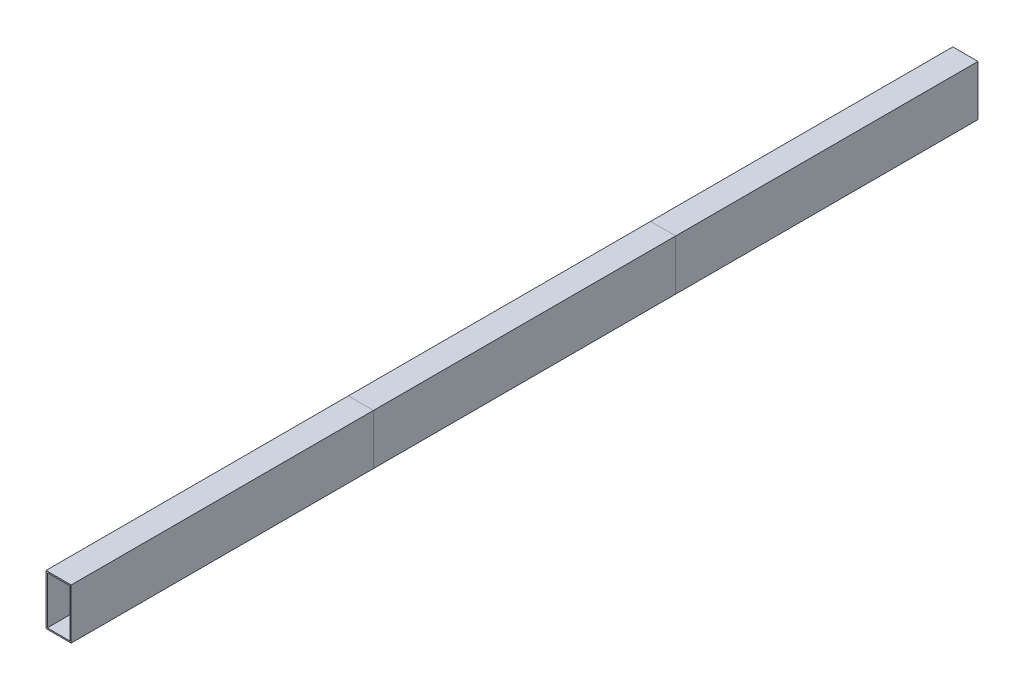
ISO-10303-21;
HEADER;
FILE_DESCRIPTION(('STEP AP214'),'2;1');
FILE_NAME('part.step','',(''),(''),'','','');
FILE_SCHEMA(('AUTOMOTIVE_DESIGN { 1 0 10303 214 1 1 1 1 }'));
ENDSEC;
DATA;
#1=APPLICATION_CONTEXT('core data for automotive mechanical design processes');
#2=APPLICATION_PROTOCOL_DEFINITION('international standard','automotive_design',2000,#1);
#3=PRODUCT_CONTEXT('',#1,'mechanical');
#4=PRODUCT('Part','Part','',(#3));
#5=PRODUCT_RELATED_PRODUCT_CATEGORY('part','',(#4));
#6=PRODUCT_DEFINITION_FORMATION('','',#4);
#7=PRODUCT_DEFINITION_CONTEXT('part definition',#1,'design');
#8=PRODUCT_DEFINITION('design','',#6,#7);
#9=PRODUCT_DEFINITION_SHAPE('','',#8);
#10=(LENGTH_UNIT() NAMED_UNIT(*) SI_UNIT(.MILLI.,.METRE.));
#11=(NAMED_UNIT(*) PLANE_ANGLE_UNIT() SI_UNIT($,.RADIAN.));
#12=(NAMED_UNIT(*) SI_UNIT($,.STERADIAN.) SOLID_ANGLE_UNIT());
#13=UNCERTAINTY_MEASURE_WITH_UNIT(LENGTH_MEASURE(1.E-05),#10,'distance_accuracy_value','');
#14=(GEOMETRIC_REPRESENTATION_CONTEXT(3) GLOBAL_UNCERTAINTY_ASSIGNED_CONTEXT((#13)) GLOBAL_UNIT_ASSIGNED_CONTEXT((#10,
#11,#12)) REPRESENTATION_CONTEXT('',''));
#15=CARTESIAN_POINT('',(0.,0.,0.));
#16=DIRECTION('',(0.,0.,1.));
#17=DIRECTION('',(1.,0.,0.));
#18=AXIS2_PLACEMENT_3D('',#15,#16,#17);
#19=CARTESIAN_POINT('',(-50.,0.,3600.));
#20=DIRECTION('',(-1.,0.,0.));
#21=DIRECTION('',(0.,0.,1.));
#22=AXIS2_PLACEMENT_3D('',#19,#20,#21);
#23=PLANE('',#22);
#24=DIRECTION('',(0.,1.,0.));
#25=VECTOR('',#24,1.);
#26=CARTESIAN_POINT('',(-50.,0.,2400.));
#27=LINE('',#26,#25);
#28=CARTESIAN_POINT('',(-50.,-100.,2400.));
#29=VERTEX_POINT('',#28);
#30=CARTESIAN_POINT('',(-50.,100.,2400.));
#31=VERTEX_POINT('',#30);
#32=EDGE_CURVE('E150',#29,#31,#27,.T.);
#33=ORIENTED_EDGE('',*,*,#32,.F.);
#34=DIRECTION('',(0.,0.,-1.));
#35=VECTOR('',#34,1.);
#36=CARTESIAN_POINT('',(-50.,-100.,3600.));
#37=LINE('',#36,#35);
#38=CARTESIAN_POINT('',(-50.,-100.,3600.));
#39=VERTEX_POINT('',#38);
#40=EDGE_CURVE('E12',#39,#29,#37,.T.);
#41=ORIENTED_EDGE('',*,*,#40,.F.);
#42=DIRECTION('',(0.,1.,0.));
#43=VECTOR('',#42,1.);
#44=CARTESIAN_POINT('',(-50.,0.,3600.));
#45=LINE('',#44,#43);
#46=CARTESIAN_POINT('',(-50.,100.,3600.));
#47=VERTEX_POINT('',#46);
#48=EDGE_CURVE('E154',#39,#47,#45,.T.);
#49=ORIENTED_EDGE('',*,*,#48,.T.);
#50=DIRECTION('',(0.,0.,-1.));
#51=VECTOR('',#50,1.);
#52=CARTESIAN_POINT('',(-50.,100.,3600.));
#53=LINE('',#52,#51);
#54=EDGE_CURVE('E55',#47,#31,#53,.T.);
#55=ORIENTED_EDGE('',*,*,#54,.T.);
#56=EDGE_LOOP('',(#33,#41,#49,#55));
#57=FACE_BOUND('',#56,.T.);
#58=ADVANCED_FACE('F52',(#57),#23,.T.);
#59=CARTESIAN_POINT('',(0.,-100.,3600.));
#60=DIRECTION('',(0.,-1.,0.));
#61=DIRECTION('',(0.,0.,-1.));
#62=AXIS2_PLACEMENT_3D('',#59,#60,#61);
#63=PLANE('',#62);
#64=DIRECTION('',(-1.,0.,0.));
#65=VECTOR('',#64,1.);
#66=CARTESIAN_POINT('',(0.,-100.,2400.));
#67=LINE('',#66,#65);
#68=CARTESIAN_POINT('',(50.,-100.,2400.));
#69=VERTEX_POINT('',#68);
#70=EDGE_CURVE('E158',#69,#29,#67,.T.);
#71=ORIENTED_EDGE('',*,*,#70,.F.);
#72=DIRECTION('',(0.,0.,-1.));
#73=VECTOR('',#72,1.);
#74=CARTESIAN_POINT('',(50.,-100.,3600.));
#75=LINE('',#74,#73);
#76=CARTESIAN_POINT('',(50.,-100.,3600.));
#77=VERTEX_POINT('',#76);
#78=EDGE_CURVE('E60',#77,#69,#75,.T.);
#79=ORIENTED_EDGE('',*,*,#78,.F.);
#80=DIRECTION('',(-1.,0.,0.));
#81=VECTOR('',#80,1.);
#82=CARTESIAN_POINT('',(0.,-100.,3600.));
#83=LINE('',#82,#81);
#84=EDGE_CURVE('E164',#77,#39,#83,.T.);
#85=ORIENTED_EDGE('',*,*,#84,.T.);
#86=ORIENTED_EDGE('',*,*,#40,.T.);
#87=EDGE_LOOP('',(#71,#79,#85,#86));
#88=FACE_BOUND('',#87,.T.);
#89=ADVANCED_FACE('F190',(#88),#63,.T.);
#90=CARTESIAN_POINT('',(50.,0.,3600.));
#91=DIRECTION('',(1.,0.,0.));
#92=DIRECTION('',(0.,0.,-1.));
#93=AXIS2_PLACEMENT_3D('',#90,#91,#92);
#94=PLANE('',#93);
#95=DIRECTION('',(0.,-1.,0.));
#96=VECTOR('',#95,1.);
#97=CARTESIAN_POINT('',(50.,0.,2400.));
#98=LINE('',#97,#96);
#99=CARTESIAN_POINT('',(50.,100.,2400.));
#100=VERTEX_POINT('',#99);
#101=EDGE_CURVE('E172',#100,#69,#98,.T.);
#102=ORIENTED_EDGE('',*,*,#101,.F.);
#103=DIRECTION('',(0.,0.,-1.));
#104=VECTOR('',#103,1.);
#105=CARTESIAN_POINT('',(50.,100.,3600.));
#106=LINE('',#105,#104);
#107=CARTESIAN_POINT('',(50.,100.,3600.));
#108=VERTEX_POINT('',#107);
#109=EDGE_CURVE('E177',#108,#100,#106,.T.);
#110=ORIENTED_EDGE('',*,*,#109,.F.);
#111=DIRECTION('',(0.,-1.,0.));
#112=VECTOR('',#111,1.);
#113=CARTESIAN_POINT('',(50.,0.,3600.));
#114=LINE('',#113,#112);
#115=EDGE_CURVE('E161',#108,#77,#114,.T.);
#116=ORIENTED_EDGE('',*,*,#115,.T.);
#117=ORIENTED_EDGE('',*,*,#78,.T.);
#118=EDGE_LOOP('',(#102,#110,#116,#117));
#119=FACE_BOUND('',#118,.T.);
#120=ADVANCED_FACE('F194',(#119),#94,.T.);
#121=CARTESIAN_POINT('',(0.,100.,3600.));
#122=DIRECTION('',(0.,1.,0.));
#123=DIRECTION('',(0.,0.,1.));
#124=AXIS2_PLACEMENT_3D('',#121,#122,#123);
#125=PLANE('',#124);
#126=DIRECTION('',(1.,0.,0.));
#127=VECTOR('',#126,1.);
#128=CARTESIAN_POINT('',(0.,100.,2400.));
#129=LINE('',#128,#127);
#130=EDGE_CURVE('E169',#31,#100,#129,.T.);
#131=ORIENTED_EDGE('',*,*,#130,.F.);
#132=ORIENTED_EDGE('',*,*,#54,.F.);
#133=DIRECTION('',(1.,0.,0.));
#134=VECTOR('',#133,1.);
#135=CARTESIAN_POINT('',(0.,100.,3600.));
#136=LINE('',#135,#134);
#137=EDGE_CURVE('E157',#47,#108,#136,.T.);
#138=ORIENTED_EDGE('',*,*,#137,.T.);
#139=ORIENTED_EDGE('',*,*,#109,.T.);
#140=EDGE_LOOP('',(#131,#132,#138,#139));
#141=FACE_BOUND('',#140,.T.);
#142=ADVANCED_FACE('F185',(#141),#125,.T.);
#143=CARTESIAN_POINT('',(0.,0.,3600.));
#144=DIRECTION('',(0.,0.,-1.));
#145=DIRECTION('',(-1.,0.,0.));
#146=AXIS2_PLACEMENT_3D('',#143,#144,#145);
#147=PLANE('',#146);
#148=DIRECTION('',(-1.,0.,0.));
#149=VECTOR('',#148,1.);
#150=CARTESIAN_POINT('',(0.,-95.,3600.));
#151=LINE('',#150,#149);
#152=CARTESIAN_POINT('',(45.,-95.,3600.));
#153=VERTEX_POINT('',#152);
#154=CARTESIAN_POINT('',(-45.,-95.,3600.));
#155=VERTEX_POINT('',#154);
#156=EDGE_CURVE('E125',#153,#155,#151,.T.);
#157=ORIENTED_EDGE('',*,*,#156,.T.);
#158=DIRECTION('',(0.,1.,0.));
#159=VECTOR('',#158,1.);
#160=CARTESIAN_POINT('',(-45.,0.,3600.));
#161=LINE('',#160,#159);
#162=CARTESIAN_POINT('',(-45.,95.,3600.));
#163=VERTEX_POINT('',#162);
#164=EDGE_CURVE('E119',#155,#163,#161,.T.);
#165=ORIENTED_EDGE('',*,*,#164,.T.);
#166=DIRECTION('',(1.,0.,0.));
#167=VECTOR('',#166,1.);
#168=CARTESIAN_POINT('',(0.,95.,3600.));
#169=LINE('',#168,#167);
#170=CARTESIAN_POINT('',(45.,95.,3600.));
#171=VERTEX_POINT('',#170);
#172=EDGE_CURVE('E128',#163,#171,#169,.T.);
#173=ORIENTED_EDGE('',*,*,#172,.T.);
#174=DIRECTION('',(0.,-1.,0.));
#175=VECTOR('',#174,1.);
#176=CARTESIAN_POINT('',(45.,0.,3600.));
#177=LINE('',#176,#175);
#178=EDGE_CURVE('E68',#171,#153,#177,.T.);
#179=ORIENTED_EDGE('',*,*,#178,.T.);
#180=EDGE_LOOP('',(#157,#165,#173,#179));
#181=FACE_BOUND('',#180,.T.);
#182=ORIENTED_EDGE('',*,*,#48,.F.);
#183=ORIENTED_EDGE('',*,*,#84,.F.);
#184=ORIENTED_EDGE('',*,*,#115,.F.);
#185=ORIENTED_EDGE('',*,*,#137,.F.);
#186=EDGE_LOOP('',(#182,#183,#184,#185));
#187=FACE_BOUND('',#186,.T.);
#188=ADVANCED_FACE('F132',(#181,#187),#147,.F.);
#189=CARTESIAN_POINT('',(0.,0.,2400.));
#190=DIRECTION('',(0.,0.,-1.));
#191=DIRECTION('',(-1.,0.,0.));
#192=AXIS2_PLACEMENT_3D('',#189,#190,#191);
#193=PLANE('',#192);
#194=DIRECTION('',(0.,1.,0.));
#195=VECTOR('',#194,1.);
#196=CARTESIAN_POINT('',(-45.,0.,2400.));
#197=LINE('',#196,#195);
#198=CARTESIAN_POINT('',(-45.,-95.,2400.));
#199=VERTEX_POINT('',#198);
#200=CARTESIAN_POINT('',(-45.,95.,2400.));
#201=VERTEX_POINT('',#200);
#202=EDGE_CURVE('E76',#199,#201,#197,.T.);
#203=ORIENTED_EDGE('',*,*,#202,.F.);
#204=DIRECTION('',(-1.,0.,0.));
#205=VECTOR('',#204,1.);
#206=CARTESIAN_POINT('',(0.,-95.,2400.));
#207=LINE('',#206,#205);
#208=CARTESIAN_POINT('',(45.,-95.,2400.));
#209=VERTEX_POINT('',#208);
#210=EDGE_CURVE('E135',#209,#199,#207,.T.);
#211=ORIENTED_EDGE('',*,*,#210,.F.);
#212=DIRECTION('',(0.,-1.,0.));
#213=VECTOR('',#212,1.);
#214=CARTESIAN_POINT('',(45.,0.,2400.));
#215=LINE('',#214,#213);
#216=CARTESIAN_POINT('',(45.,95.,2400.));
#217=VERTEX_POINT('',#216);
#218=EDGE_CURVE('E138',#217,#209,#215,.T.);
#219=ORIENTED_EDGE('',*,*,#218,.F.);
#220=DIRECTION('',(1.,0.,0.));
#221=VECTOR('',#220,1.);
#222=CARTESIAN_POINT('',(0.,95.,2400.));
#223=LINE('',#222,#221);
#224=EDGE_CURVE('E144',#201,#217,#223,.T.);
#225=ORIENTED_EDGE('',*,*,#224,.F.);
#226=EDGE_LOOP('',(#203,#211,#219,#225));
#227=FACE_BOUND('',#226,.T.);
#228=ORIENTED_EDGE('',*,*,#32,.T.);
#229=ORIENTED_EDGE('',*,*,#130,.T.);
#230=ORIENTED_EDGE('',*,*,#101,.T.);
#231=ORIENTED_EDGE('',*,*,#70,.T.);
#232=EDGE_LOOP('',(#228,#229,#230,#231));
#233=FACE_BOUND('',#232,.T.);
#234=ADVANCED_FACE('F187',(#227,#233),#193,.T.);
#235=CARTESIAN_POINT('',(-45.,0.,3600.));
#236=DIRECTION('',(-1.,0.,0.));
#237=DIRECTION('',(0.,0.,1.));
#238=AXIS2_PLACEMENT_3D('',#235,#236,#237);
#239=PLANE('',#238);
#240=ORIENTED_EDGE('',*,*,#202,.T.);
#241=DIRECTION('',(0.,0.,-1.));
#242=VECTOR('',#241,1.);
#243=CARTESIAN_POINT('',(-45.,95.,3600.));
#244=LINE('',#243,#242);
#245=EDGE_CURVE('E115',#163,#201,#244,.T.);
#246=ORIENTED_EDGE('',*,*,#245,.F.);
#247=ORIENTED_EDGE('',*,*,#164,.F.);
#248=DIRECTION('',(0.,0.,-1.));
#249=VECTOR('',#248,1.);
#250=CARTESIAN_POINT('',(-45.,-95.,3600.));
#251=LINE('',#250,#249);
#252=EDGE_CURVE('E148',#155,#199,#251,.T.);
#253=ORIENTED_EDGE('',*,*,#252,.T.);
#254=EDGE_LOOP('',(#240,#246,#247,#253));
#255=FACE_BOUND('',#254,.T.);
#256=ADVANCED_FACE('F117',(#255),#239,.F.);
#257=CARTESIAN_POINT('',(0.,-95.,3600.));
#258=DIRECTION('',(0.,-1.,0.));
#259=DIRECTION('',(0.,0.,-1.));
#260=AXIS2_PLACEMENT_3D('',#257,#258,#259);
#261=PLANE('',#260);
#262=ORIENTED_EDGE('',*,*,#210,.T.);
#263=ORIENTED_EDGE('',*,*,#252,.F.);
#264=ORIENTED_EDGE('',*,*,#156,.F.);
#265=DIRECTION('',(0.,0.,-1.));
#266=VECTOR('',#265,1.);
#267=CARTESIAN_POINT('',(45.,-95.,3600.));
#268=LINE('',#267,#266);
#269=EDGE_CURVE('E151',#153,#209,#268,.T.);
#270=ORIENTED_EDGE('',*,*,#269,.T.);
#271=EDGE_LOOP('',(#262,#263,#264,#270));
#272=FACE_BOUND('',#271,.T.);
#273=ADVANCED_FACE('F245',(#272),#261,.F.);
#274=CARTESIAN_POINT('',(45.,0.,3600.));
#275=DIRECTION('',(1.,0.,0.));
#276=DIRECTION('',(0.,0.,-1.));
#277=AXIS2_PLACEMENT_3D('',#274,#275,#276);
#278=PLANE('',#277);
#279=ORIENTED_EDGE('',*,*,#218,.T.);
#280=ORIENTED_EDGE('',*,*,#269,.F.);
#281=ORIENTED_EDGE('',*,*,#178,.F.);
#282=DIRECTION('',(0.,0.,-1.));
#283=VECTOR('',#282,1.);
#284=CARTESIAN_POINT('',(45.,95.,3600.));
#285=LINE('',#284,#283);
#286=EDGE_CURVE('E124',#171,#217,#285,.T.);
#287=ORIENTED_EDGE('',*,*,#286,.T.);
#288=EDGE_LOOP('',(#279,#280,#281,#287));
#289=FACE_BOUND('',#288,.T.);
#290=ADVANCED_FACE('F254',(#289),#278,.F.);
#291=CARTESIAN_POINT('',(0.,95.,3600.));
#292=DIRECTION('',(0.,1.,0.));
#293=DIRECTION('',(0.,0.,1.));
#294=AXIS2_PLACEMENT_3D('',#291,#292,#293);
#295=PLANE('',#294);
#296=ORIENTED_EDGE('',*,*,#224,.T.);
#297=ORIENTED_EDGE('',*,*,#286,.F.);
#298=ORIENTED_EDGE('',*,*,#172,.F.);
#299=ORIENTED_EDGE('',*,*,#245,.T.);
#300=EDGE_LOOP('',(#296,#297,#298,#299));
#301=FACE_BOUND('',#300,.T.);
#302=ADVANCED_FACE('F129',(#301),#295,.F.);
#303=CLOSED_SHELL('',(#58,#89,#120,#142,#188,#234,#256,#273,#290,#302));
#304=MANIFOLD_SOLID_BREP('B2',#303);
#305=CARTESIAN_POINT('',(0.,0.,2400.));
#306=DIRECTION('',(0.,0.,1.));
#307=DIRECTION('',(1.,0.,0.));
#308=AXIS2_PLACEMENT_3D('',#305,#306,#307);
#309=PLANE('',#308);
#310=DIRECTION('',(0.,1.,0.));
#311=VECTOR('',#310,1.);
#312=CARTESIAN_POINT('',(50.,0.,2400.));
#313=LINE('',#312,#311);
#314=CARTESIAN_POINT('',(50.,-100.,2400.));
#315=VERTEX_POINT('',#314);
#316=CARTESIAN_POINT('',(50.,100.,2400.));
#317=VERTEX_POINT('',#316);
#318=EDGE_CURVE('E392',#315,#317,#313,.T.);
#319=ORIENTED_EDGE('',*,*,#318,.T.);
#320=DIRECTION('',(-1.,0.,0.));
#321=VECTOR('',#320,1.);
#322=CARTESIAN_POINT('',(0.,100.,2400.));
#323=LINE('',#322,#321);
#324=CARTESIAN_POINT('',(-50.,100.,2400.));
#325=VERTEX_POINT('',#324);
#326=EDGE_CURVE('E395',#317,#325,#323,.T.);
#327=ORIENTED_EDGE('',*,*,#326,.T.);
#328=DIRECTION('',(0.,-1.,0.));
#329=VECTOR('',#328,1.);
#330=CARTESIAN_POINT('',(-50.,0.,2400.));
#331=LINE('',#330,#329);
#332=CARTESIAN_POINT('',(-50.,-100.,2400.));
#333=VERTEX_POINT('',#332);
#334=EDGE_CURVE('E398',#325,#333,#331,.T.);
#335=ORIENTED_EDGE('',*,*,#334,.T.);
#336=DIRECTION('',(1.,0.,0.));
#337=VECTOR('',#336,1.);
#338=CARTESIAN_POINT('',(0.,-100.,2400.));
#339=LINE('',#338,#337);
#340=EDGE_CURVE('E400',#333,#315,#339,.T.);
#341=ORIENTED_EDGE('',*,*,#340,.T.);
#342=EDGE_LOOP('',(#319,#327,#335,#341));
#343=FACE_BOUND('',#342,.T.);
#344=DIRECTION('',(-1.,0.,0.));
#345=VECTOR('',#344,1.);
#346=CARTESIAN_POINT('',(0.,95.,2400.));
#347=LINE('',#346,#345);
#348=CARTESIAN_POINT('',(45.,95.,2400.));
#349=VERTEX_POINT('',#348);
#350=CARTESIAN_POINT('',(-45.,95.,2400.));
#351=VERTEX_POINT('',#350);
#352=EDGE_CURVE('E364',#349,#351,#347,.T.);
#353=ORIENTED_EDGE('',*,*,#352,.F.);
#354=DIRECTION('',(0.,1.,0.));
#355=VECTOR('',#354,1.);
#356=CARTESIAN_POINT('',(45.,0.,2400.));
#357=LINE('',#356,#355);
#358=CARTESIAN_POINT('',(45.,-95.,2400.));
#359=VERTEX_POINT('',#358);
#360=EDGE_CURVE('E356',#359,#349,#357,.T.);
#361=ORIENTED_EDGE('',*,*,#360,.F.);
#362=DIRECTION('',(1.,0.,0.));
#363=VECTOR('',#362,1.);
#364=CARTESIAN_POINT('',(0.,-95.,2400.));
#365=LINE('',#364,#363);
#366=CARTESIAN_POINT('',(-45.,-95.,2400.));
#367=VERTEX_POINT('',#366);
#368=EDGE_CURVE('E378',#367,#359,#365,.T.);
#369=ORIENTED_EDGE('',*,*,#368,.F.);
#370=DIRECTION('',(0.,-1.,0.));
#371=VECTOR('',#370,1.);
#372=CARTESIAN_POINT('',(-45.,0.,2400.));
#373=LINE('',#372,#371);
#374=EDGE_CURVE('E376',#351,#367,#373,.T.);
#375=ORIENTED_EDGE('',*,*,#374,.F.);
#376=EDGE_LOOP('',(#353,#361,#369,#375));
#377=FACE_BOUND('',#376,.T.);
#378=ADVANCED_FACE('F291',(#343,#377),#309,.T.);
#379=CARTESIAN_POINT('',(0.,0.,1200.));
#380=DIRECTION('',(0.,0.,1.));
#381=DIRECTION('',(1.,0.,0.));
#382=AXIS2_PLACEMENT_3D('',#379,#380,#381);
#383=PLANE('',#382);
#384=DIRECTION('',(0.,1.,0.));
#385=VECTOR('',#384,1.);
#386=CARTESIAN_POINT('',(50.,0.,1200.));
#387=LINE('',#386,#385);
#388=CARTESIAN_POINT('',(50.,-100.,1200.));
#389=VERTEX_POINT('',#388);
#390=CARTESIAN_POINT('',(50.,100.,1200.));
#391=VERTEX_POINT('',#390);
#392=EDGE_CURVE('E372',#389,#391,#387,.T.);
#393=ORIENTED_EDGE('',*,*,#392,.F.);
#394=DIRECTION('',(1.,0.,0.));
#395=VECTOR('',#394,1.);
#396=CARTESIAN_POINT('',(0.,-100.,1200.));
#397=LINE('',#396,#395);
#398=CARTESIAN_POINT('',(-50.,-100.,1200.));
#399=VERTEX_POINT('',#398);
#400=EDGE_CURVE('E396',#399,#389,#397,.T.);
#401=ORIENTED_EDGE('',*,*,#400,.F.);
#402=DIRECTION('',(0.,-1.,0.));
#403=VECTOR('',#402,1.);
#404=CARTESIAN_POINT('',(-50.,0.,1200.));
#405=LINE('',#404,#403);
#406=CARTESIAN_POINT('',(-50.,100.,1200.));
#407=VERTEX_POINT('',#406);
#408=EDGE_CURVE('E407',#407,#399,#405,.T.);
#409=ORIENTED_EDGE('',*,*,#408,.F.);
#410=DIRECTION('',(-1.,0.,0.));
#411=VECTOR('',#410,1.);
#412=CARTESIAN_POINT('',(0.,100.,1200.));
#413=LINE('',#412,#411);
#414=EDGE_CURVE('E405',#391,#407,#413,.T.);
#415=ORIENTED_EDGE('',*,*,#414,.F.);
#416=EDGE_LOOP('',(#393,#401,#409,#415));
#417=FACE_BOUND('',#416,.T.);
#418=DIRECTION('',(0.,1.,0.));
#419=VECTOR('',#418,1.);
#420=CARTESIAN_POINT('',(45.,0.,1200.));
#421=LINE('',#420,#419);
#422=CARTESIAN_POINT('',(45.,-95.,1200.));
#423=VERTEX_POINT('',#422);
#424=CARTESIAN_POINT('',(45.,95.,1200.));
#425=VERTEX_POINT('',#424);
#426=EDGE_CURVE('E314',#423,#425,#421,.T.);
#427=ORIENTED_EDGE('',*,*,#426,.T.);
#428=DIRECTION('',(-1.,0.,0.));
#429=VECTOR('',#428,1.);
#430=CARTESIAN_POINT('',(0.,95.,1200.));
#431=LINE('',#430,#429);
#432=CARTESIAN_POINT('',(-45.,95.,1200.));
#433=VERTEX_POINT('',#432);
#434=EDGE_CURVE('E371',#425,#433,#431,.T.);
#435=ORIENTED_EDGE('',*,*,#434,.T.);
#436=DIRECTION('',(0.,-1.,0.));
#437=VECTOR('',#436,1.);
#438=CARTESIAN_POINT('',(-45.,0.,1200.));
#439=LINE('',#438,#437);
#440=CARTESIAN_POINT('',(-45.,-95.,1200.));
#441=VERTEX_POINT('',#440);
#442=EDGE_CURVE('E384',#433,#441,#439,.T.);
#443=ORIENTED_EDGE('',*,*,#442,.T.);
#444=DIRECTION('',(1.,0.,0.));
#445=VECTOR('',#444,1.);
#446=CARTESIAN_POINT('',(0.,-95.,1200.));
#447=LINE('',#446,#445);
#448=EDGE_CURVE('E365',#441,#423,#447,.T.);
#449=ORIENTED_EDGE('',*,*,#448,.T.);
#450=EDGE_LOOP('',(#427,#435,#443,#449));
#451=FACE_BOUND('',#450,.T.);
#452=ADVANCED_FACE('F425',(#417,#451),#383,.F.);
#453=CARTESIAN_POINT('',(50.,0.,2400.));
#454=DIRECTION('',(-1.,0.,0.));
#455=DIRECTION('',(0.,0.,1.));
#456=AXIS2_PLACEMENT_3D('',#453,#454,#455);
#457=PLANE('',#456);
#458=ORIENTED_EDGE('',*,*,#392,.T.);
#459=DIRECTION('',(0.,0.,-1.));
#460=VECTOR('',#459,1.);
#461=CARTESIAN_POINT('',(50.,100.,2400.));
#462=LINE('',#461,#460);
#463=EDGE_CURVE('E50',#317,#391,#462,.T.);
#464=ORIENTED_EDGE('',*,*,#463,.F.);
#465=ORIENTED_EDGE('',*,*,#318,.F.);
#466=DIRECTION('',(0.,0.,-1.));
#467=VECTOR('',#466,1.);
#468=CARTESIAN_POINT('',(50.,-100.,2400.));
#469=LINE('',#468,#467);
#470=EDGE_CURVE('E402',#315,#389,#469,.T.);
#471=ORIENTED_EDGE('',*,*,#470,.T.);
#472=EDGE_LOOP('',(#458,#464,#465,#471));
#473=FACE_BOUND('',#472,.T.);
#474=ADVANCED_FACE('F293',(#473),#457,.F.);
#475=CARTESIAN_POINT('',(0.,100.,2400.));
#476=DIRECTION('',(0.,-1.,0.));
#477=DIRECTION('',(0.,0.,-1.));
#478=AXIS2_PLACEMENT_3D('',#475,#476,#477);
#479=PLANE('',#478);
#480=ORIENTED_EDGE('',*,*,#414,.T.);
#481=DIRECTION('',(0.,0.,-1.));
#482=VECTOR('',#481,1.);
#483=CARTESIAN_POINT('',(-50.,100.,2400.));
#484=LINE('',#483,#482);
#485=EDGE_CURVE('E299',#325,#407,#484,.T.);
#486=ORIENTED_EDGE('',*,*,#485,.F.);
#487=ORIENTED_EDGE('',*,*,#326,.F.);
#488=ORIENTED_EDGE('',*,*,#463,.T.);
#489=EDGE_LOOP('',(#480,#486,#487,#488));
#490=FACE_BOUND('',#489,.T.);
#491=ADVANCED_FACE('F435',(#490),#479,.F.);
#492=CARTESIAN_POINT('',(-50.,0.,2400.));
#493=DIRECTION('',(1.,0.,0.));
#494=DIRECTION('',(0.,0.,-1.));
#495=AXIS2_PLACEMENT_3D('',#492,#493,#494);
#496=PLANE('',#495);
#497=ORIENTED_EDGE('',*,*,#408,.T.);
#498=DIRECTION('',(0.,0.,-1.));
#499=VECTOR('',#498,1.);
#500=CARTESIAN_POINT('',(-50.,-100.,2400.));
#501=LINE('',#500,#499);
#502=EDGE_CURVE('E412',#333,#399,#501,.T.);
#503=ORIENTED_EDGE('',*,*,#502,.F.);
#504=ORIENTED_EDGE('',*,*,#334,.F.);
#505=ORIENTED_EDGE('',*,*,#485,.T.);
#506=EDGE_LOOP('',(#497,#503,#504,#505));
#507=FACE_BOUND('',#506,.T.);
#508=ADVANCED_FACE('F419',(#507),#496,.F.);
#509=CARTESIAN_POINT('',(0.,-100.,2400.));
#510=DIRECTION('',(0.,1.,0.));
#511=DIRECTION('',(0.,0.,1.));
#512=AXIS2_PLACEMENT_3D('',#509,#510,#511);
#513=PLANE('',#512);
#514=ORIENTED_EDGE('',*,*,#400,.T.);
#515=ORIENTED_EDGE('',*,*,#470,.F.);
#516=ORIENTED_EDGE('',*,*,#340,.F.);
#517=ORIENTED_EDGE('',*,*,#502,.T.);
#518=EDGE_LOOP('',(#514,#515,#516,#517));
#519=FACE_BOUND('',#518,.T.);
#520=ADVANCED_FACE('F429',(#519),#513,.F.);
#521=CARTESIAN_POINT('',(45.,0.,2400.));
#522=DIRECTION('',(-1.,0.,0.));
#523=DIRECTION('',(0.,0.,1.));
#524=AXIS2_PLACEMENT_3D('',#521,#522,#523);
#525=PLANE('',#524);
#526=ORIENTED_EDGE('',*,*,#426,.F.);
#527=DIRECTION('',(0.,0.,-1.));
#528=VECTOR('',#527,1.);
#529=CARTESIAN_POINT('',(45.,-95.,2400.));
#530=LINE('',#529,#528);
#531=EDGE_CURVE('E360',#359,#423,#530,.T.);
#532=ORIENTED_EDGE('',*,*,#531,.F.);
#533=ORIENTED_EDGE('',*,*,#360,.T.);
#534=DIRECTION('',(0.,0.,-1.));
#535=VECTOR('',#534,1.);
#536=CARTESIAN_POINT('',(45.,95.,2400.));
#537=LINE('',#536,#535);
#538=EDGE_CURVE('E359',#349,#425,#537,.T.);
#539=ORIENTED_EDGE('',*,*,#538,.T.);
#540=EDGE_LOOP('',(#526,#532,#533,#539));
#541=FACE_BOUND('',#540,.T.);
#542=ADVANCED_FACE('F358',(#541),#525,.T.);
#543=CARTESIAN_POINT('',(0.,95.,2400.));
#544=DIRECTION('',(0.,-1.,0.));
#545=DIRECTION('',(0.,0.,-1.));
#546=AXIS2_PLACEMENT_3D('',#543,#544,#545);
#547=PLANE('',#546);
#548=ORIENTED_EDGE('',*,*,#434,.F.);
#549=ORIENTED_EDGE('',*,*,#538,.F.);
#550=ORIENTED_EDGE('',*,*,#352,.T.);
#551=DIRECTION('',(0.,0.,-1.));
#552=VECTOR('',#551,1.);
#553=CARTESIAN_POINT('',(-45.,95.,2400.));
#554=LINE('',#553,#552);
#555=EDGE_CURVE('E373',#351,#433,#554,.T.);
#556=ORIENTED_EDGE('',*,*,#555,.T.);
#557=EDGE_LOOP('',(#548,#549,#550,#556));
#558=FACE_BOUND('',#557,.T.);
#559=ADVANCED_FACE('F368',(#558),#547,.T.);
#560=CARTESIAN_POINT('',(-45.,0.,2400.));
#561=DIRECTION('',(1.,0.,0.));
#562=DIRECTION('',(0.,0.,-1.));
#563=AXIS2_PLACEMENT_3D('',#560,#561,#562);
#564=PLANE('',#563);
#565=ORIENTED_EDGE('',*,*,#442,.F.);
#566=ORIENTED_EDGE('',*,*,#555,.F.);
#567=ORIENTED_EDGE('',*,*,#374,.T.);
#568=DIRECTION('',(0.,0.,-1.));
#569=VECTOR('',#568,1.);
#570=CARTESIAN_POINT('',(-45.,-95.,2400.));
#571=LINE('',#570,#569);
#572=EDGE_CURVE('E306',#367,#441,#571,.T.);
#573=ORIENTED_EDGE('',*,*,#572,.T.);
#574=EDGE_LOOP('',(#565,#566,#567,#573));
#575=FACE_BOUND('',#574,.T.);
#576=ADVANCED_FACE('F458',(#575),#564,.T.);
#577=CARTESIAN_POINT('',(0.,-95.,2400.));
#578=DIRECTION('',(0.,1.,0.));
#579=DIRECTION('',(0.,0.,1.));
#580=AXIS2_PLACEMENT_3D('',#577,#578,#579);
#581=PLANE('',#580);
#582=ORIENTED_EDGE('',*,*,#448,.F.);
#583=ORIENTED_EDGE('',*,*,#572,.F.);
#584=ORIENTED_EDGE('',*,*,#368,.T.);
#585=ORIENTED_EDGE('',*,*,#531,.T.);
#586=EDGE_LOOP('',(#582,#583,#584,#585));
#587=FACE_BOUND('',#586,.T.);
#588=ADVANCED_FACE('F462',(#587),#581,.T.);
#589=CLOSED_SHELL('',(#378,#452,#474,#491,#508,#520,#542,#559,#576,#588));
#590=MANIFOLD_SOLID_BREP('B6',#589);
#591=CARTESIAN_POINT('',(0.,0.,1200.));
#592=DIRECTION('',(0.,0.,-1.));
#593=DIRECTION('',(-1.,0.,0.));
#594=AXIS2_PLACEMENT_3D('',#591,#592,#593);
#595=PLANE('',#594);
#596=DIRECTION('',(0.,1.,0.));
#597=VECTOR('',#596,1.);
#598=CARTESIAN_POINT('',(50.,-100.,1200.));
#599=LINE('',#598,#597);
#600=CARTESIAN_POINT('',(50.,-100.,1200.));
#601=VERTEX_POINT('',#600);
#602=CARTESIAN_POINT('',(50.,100.,1200.));
#603=VERTEX_POINT('',#602);
#604=EDGE_CURVE('E635',#601,#603,#599,.T.);
#605=ORIENTED_EDGE('',*,*,#604,.T.);
#606=DIRECTION('',(-1.,0.,0.));
#607=VECTOR('',#606,1.);
#608=CARTESIAN_POINT('',(-50.,100.,1200.));
#609=LINE('',#608,#607);
#610=CARTESIAN_POINT('',(-50.,100.,1200.));
#611=VERTEX_POINT('',#610);
#612=EDGE_CURVE('E639',#603,#611,#609,.T.);
#613=ORIENTED_EDGE('',*,*,#612,.T.);
#614=DIRECTION('',(0.,-1.,0.));
#615=VECTOR('',#614,1.);
#616=CARTESIAN_POINT('',(-50.,-100.,1200.));
#617=LINE('',#616,#615);
#618=CARTESIAN_POINT('',(-50.,-100.,1200.));
#619=VERTEX_POINT('',#618);
#620=EDGE_CURVE('E643',#611,#619,#617,.T.);
#621=ORIENTED_EDGE('',*,*,#620,.T.);
#622=DIRECTION('',(1.,0.,0.));
#623=VECTOR('',#622,1.);
#624=CARTESIAN_POINT('',(-50.,-100.,1200.));
#625=LINE('',#624,#623);
#626=EDGE_CURVE('E646',#619,#601,#625,.T.);
#627=ORIENTED_EDGE('',*,*,#626,.T.);
#628=EDGE_LOOP('',(#605,#613,#621,#627));
#629=FACE_BOUND('',#628,.T.);
#630=DIRECTION('',(0.,1.,0.));
#631=VECTOR('',#630,1.);
#632=CARTESIAN_POINT('',(45.,-95.,1200.));
#633=LINE('',#632,#631);
#634=CARTESIAN_POINT('',(45.,-95.,1200.));
#635=VERTEX_POINT('',#634);
#636=CARTESIAN_POINT('',(45.,95.,1200.));
#637=VERTEX_POINT('',#636);
#638=EDGE_CURVE('E587',#635,#637,#633,.T.);
#639=ORIENTED_EDGE('',*,*,#638,.F.);
#640=DIRECTION('',(1.,0.,0.));
#641=VECTOR('',#640,1.);
#642=CARTESIAN_POINT('',(-45.,-95.,1200.));
#643=LINE('',#642,#641);
#644=CARTESIAN_POINT('',(-45.,-95.,1200.));
#645=VERTEX_POINT('',#644);
#646=EDGE_CURVE('E613',#645,#635,#643,.T.);
#647=ORIENTED_EDGE('',*,*,#646,.F.);
#648=DIRECTION('',(0.,-1.,0.));
#649=VECTOR('',#648,1.);
#650=CARTESIAN_POINT('',(-45.,-95.,1200.));
#651=LINE('',#650,#649);
#652=CARTESIAN_POINT('',(-45.,95.,1200.));
#653=VERTEX_POINT('',#652);
#654=EDGE_CURVE('E609',#653,#645,#651,.T.);
#655=ORIENTED_EDGE('',*,*,#654,.F.);
#656=DIRECTION('',(-1.,0.,0.));
#657=VECTOR('',#656,1.);
#658=CARTESIAN_POINT('',(-45.,95.,1200.));
#659=LINE('',#658,#657);
#660=EDGE_CURVE('E596',#637,#653,#659,.T.);
#661=ORIENTED_EDGE('',*,*,#660,.F.);
#662=EDGE_LOOP('',(#639,#647,#655,#661));
#663=FACE_BOUND('',#662,.T.);
#664=ADVANCED_FACE('F521',(#629,#663),#595,.F.);
#665=CARTESIAN_POINT('',(0.,0.,0.));
#666=DIRECTION('',(0.,0.,-1.));
#667=DIRECTION('',(-1.,0.,0.));
#668=AXIS2_PLACEMENT_3D('',#665,#666,#667);
#669=PLANE('',#668);
#670=DIRECTION('',(0.,1.,0.));
#671=VECTOR('',#670,1.);
#672=CARTESIAN_POINT('',(50.,-100.,0.));
#673=LINE('',#672,#671);
#674=CARTESIAN_POINT('',(50.,-100.,0.));
#675=VERTEX_POINT('',#674);
#676=CARTESIAN_POINT('',(50.,100.,0.));
#677=VERTEX_POINT('',#676);
#678=EDGE_CURVE('E605',#675,#677,#673,.T.);
#679=ORIENTED_EDGE('',*,*,#678,.F.);
#680=DIRECTION('',(1.,0.,0.));
#681=VECTOR('',#680,1.);
#682=CARTESIAN_POINT('',(-50.,-100.,0.));
#683=LINE('',#682,#681);
#684=CARTESIAN_POINT('',(-50.,-100.,0.));
#685=VERTEX_POINT('',#684);
#686=EDGE_CURVE('E640',#685,#675,#683,.T.);
#687=ORIENTED_EDGE('',*,*,#686,.F.);
#688=DIRECTION('',(0.,-1.,0.));
#689=VECTOR('',#688,1.);
#690=CARTESIAN_POINT('',(-50.,-100.,0.));
#691=LINE('',#690,#689);
#692=CARTESIAN_POINT('',(-50.,100.,0.));
#693=VERTEX_POINT('',#692);
#694=EDGE_CURVE('E656',#693,#685,#691,.T.);
#695=ORIENTED_EDGE('',*,*,#694,.F.);
#696=DIRECTION('',(-1.,0.,0.));
#697=VECTOR('',#696,1.);
#698=CARTESIAN_POINT('',(-50.,100.,0.));
#699=LINE('',#698,#697);
#700=EDGE_CURVE('E653',#677,#693,#699,.T.);
#701=ORIENTED_EDGE('',*,*,#700,.F.);
#702=EDGE_LOOP('',(#679,#687,#695,#701));
#703=FACE_BOUND('',#702,.T.);
#704=DIRECTION('',(1.,0.,0.));
#705=VECTOR('',#704,1.);
#706=CARTESIAN_POINT('',(-45.,-95.,0.));
#707=LINE('',#706,#705);
#708=CARTESIAN_POINT('',(-45.,-95.,0.));
#709=VERTEX_POINT('',#708);
#710=CARTESIAN_POINT('',(45.,-95.,0.));
#711=VERTEX_POINT('',#710);
#712=EDGE_CURVE('E597',#709,#711,#707,.T.);
#713=ORIENTED_EDGE('',*,*,#712,.T.);
#714=DIRECTION('',(0.,1.,0.));
#715=VECTOR('',#714,1.);
#716=CARTESIAN_POINT('',(45.,-95.,0.));
#717=LINE('',#716,#715);
#718=CARTESIAN_POINT('',(45.,95.,0.));
#719=VERTEX_POINT('',#718);
#720=EDGE_CURVE('E545',#711,#719,#717,.T.);
#721=ORIENTED_EDGE('',*,*,#720,.T.);
#722=DIRECTION('',(-1.,0.,0.));
#723=VECTOR('',#722,1.);
#724=CARTESIAN_POINT('',(-45.,95.,0.));
#725=LINE('',#724,#723);
#726=CARTESIAN_POINT('',(-45.,95.,0.));
#727=VERTEX_POINT('',#726);
#728=EDGE_CURVE('E603',#719,#727,#725,.T.);
#729=ORIENTED_EDGE('',*,*,#728,.T.);
#730=DIRECTION('',(0.,-1.,0.));
#731=VECTOR('',#730,1.);
#732=CARTESIAN_POINT('',(-45.,-95.,0.));
#733=LINE('',#732,#731);
#734=EDGE_CURVE('E622',#727,#709,#733,.T.);
#735=ORIENTED_EDGE('',*,*,#734,.T.);
#736=EDGE_LOOP('',(#713,#721,#729,#735));
#737=FACE_BOUND('',#736,.T.);
#738=ADVANCED_FACE('F679',(#703,#737),#669,.T.);
#739=CARTESIAN_POINT('',(50.,-100.,1200.));
#740=DIRECTION('',(-1.,0.,0.));
#741=DIRECTION('',(0.,0.,1.));
#742=AXIS2_PLACEMENT_3D('',#739,#740,#741);
#743=PLANE('',#742);
#744=ORIENTED_EDGE('',*,*,#678,.T.);
#745=DIRECTION('',(0.,0.,-1.));
#746=VECTOR('',#745,1.);
#747=CARTESIAN_POINT('',(50.,100.,1200.));
#748=LINE('',#747,#746);
#749=EDGE_CURVE('E289',#603,#677,#748,.T.);
#750=ORIENTED_EDGE('',*,*,#749,.F.);
#751=ORIENTED_EDGE('',*,*,#604,.F.);
#752=DIRECTION('',(0.,0.,-1.));
#753=VECTOR('',#752,1.);
#754=CARTESIAN_POINT('',(50.,-100.,1200.));
#755=LINE('',#754,#753);
#756=EDGE_CURVE('E649',#601,#675,#755,.T.);
#757=ORIENTED_EDGE('',*,*,#756,.T.);
#758=EDGE_LOOP('',(#744,#750,#751,#757));
#759=FACE_BOUND('',#758,.T.);
#760=ADVANCED_FACE('F523',(#759),#743,.F.);
#761=CARTESIAN_POINT('',(-50.,100.,1200.));
#762=DIRECTION('',(0.,-1.,0.));
#763=DIRECTION('',(0.,0.,-1.));
#764=AXIS2_PLACEMENT_3D('',#761,#762,#763);
#765=PLANE('',#764);
#766=ORIENTED_EDGE('',*,*,#700,.T.);
#767=DIRECTION('',(0.,0.,-1.));
#768=VECTOR('',#767,1.);
#769=CARTESIAN_POINT('',(-50.,100.,1200.));
#770=LINE('',#769,#768);
#771=EDGE_CURVE('E530',#611,#693,#770,.T.);
#772=ORIENTED_EDGE('',*,*,#771,.F.);
#773=ORIENTED_EDGE('',*,*,#612,.F.);
#774=ORIENTED_EDGE('',*,*,#749,.T.);
#775=EDGE_LOOP('',(#766,#772,#773,#774));
#776=FACE_BOUND('',#775,.T.);
#777=ADVANCED_FACE('F689',(#776),#765,.F.);
#778=CARTESIAN_POINT('',(-50.,-100.,1200.));
#779=DIRECTION('',(1.,0.,0.));
#780=DIRECTION('',(0.,0.,-1.));
#781=AXIS2_PLACEMENT_3D('',#778,#779,#780);
#782=PLANE('',#781);
#783=ORIENTED_EDGE('',*,*,#694,.T.);
#784=DIRECTION('',(0.,0.,-1.));
#785=VECTOR('',#784,1.);
#786=CARTESIAN_POINT('',(-50.,-100.,1200.));
#787=LINE('',#786,#785);
#788=EDGE_CURVE('E664',#619,#685,#787,.T.);
#789=ORIENTED_EDGE('',*,*,#788,.F.);
#790=ORIENTED_EDGE('',*,*,#620,.F.);
#791=ORIENTED_EDGE('',*,*,#771,.T.);
#792=EDGE_LOOP('',(#783,#789,#790,#791));
#793=FACE_BOUND('',#792,.T.);
#794=ADVANCED_FACE('F673',(#793),#782,.F.);
#795=CARTESIAN_POINT('',(-50.,-100.,1200.));
#796=DIRECTION('',(0.,1.,0.));
#797=DIRECTION('',(0.,0.,1.));
#798=AXIS2_PLACEMENT_3D('',#795,#796,#797);
#799=PLANE('',#798);
#800=ORIENTED_EDGE('',*,*,#686,.T.);
#801=ORIENTED_EDGE('',*,*,#756,.F.);
#802=ORIENTED_EDGE('',*,*,#626,.F.);
#803=ORIENTED_EDGE('',*,*,#788,.T.);
#804=EDGE_LOOP('',(#800,#801,#802,#803));
#805=FACE_BOUND('',#804,.T.);
#806=ADVANCED_FACE('F683',(#805),#799,.F.);
#807=CARTESIAN_POINT('',(45.,-95.,1200.));
#808=DIRECTION('',(-1.,0.,0.));
#809=DIRECTION('',(0.,0.,1.));
#810=AXIS2_PLACEMENT_3D('',#807,#808,#809);
#811=PLANE('',#810);
#812=ORIENTED_EDGE('',*,*,#720,.F.);
#813=DIRECTION('',(0.,0.,-1.));
#814=VECTOR('',#813,1.);
#815=CARTESIAN_POINT('',(45.,-95.,1200.));
#816=LINE('',#815,#814);
#817=EDGE_CURVE('E591',#635,#711,#816,.T.);
#818=ORIENTED_EDGE('',*,*,#817,.F.);
#819=ORIENTED_EDGE('',*,*,#638,.T.);
#820=DIRECTION('',(0.,0.,-1.));
#821=VECTOR('',#820,1.);
#822=CARTESIAN_POINT('',(45.,95.,1200.));
#823=LINE('',#822,#821);
#824=EDGE_CURVE('E590',#637,#719,#823,.T.);
#825=ORIENTED_EDGE('',*,*,#824,.T.);
#826=EDGE_LOOP('',(#812,#818,#819,#825));
#827=FACE_BOUND('',#826,.T.);
#828=ADVANCED_FACE('F589',(#827),#811,.T.);
#829=CARTESIAN_POINT('',(-45.,95.,1200.));
#830=DIRECTION('',(0.,-1.,0.));
#831=DIRECTION('',(0.,0.,-1.));
#832=AXIS2_PLACEMENT_3D('',#829,#830,#831);
#833=PLANE('',#832);
#834=ORIENTED_EDGE('',*,*,#728,.F.);
#835=ORIENTED_EDGE('',*,*,#824,.F.);
#836=ORIENTED_EDGE('',*,*,#660,.T.);
#837=DIRECTION('',(0.,0.,-1.));
#838=VECTOR('',#837,1.);
#839=CARTESIAN_POINT('',(-45.,95.,1200.));
#840=LINE('',#839,#838);
#841=EDGE_CURVE('E606',#653,#727,#840,.T.);
#842=ORIENTED_EDGE('',*,*,#841,.T.);
#843=EDGE_LOOP('',(#834,#835,#836,#842));
#844=FACE_BOUND('',#843,.T.);
#845=ADVANCED_FACE('F600',(#844),#833,.T.);
#846=CARTESIAN_POINT('',(-45.,-95.,1200.));
#847=DIRECTION('',(1.,0.,0.));
#848=DIRECTION('',(0.,0.,-1.));
#849=AXIS2_PLACEMENT_3D('',#846,#847,#848);
#850=PLANE('',#849);
#851=ORIENTED_EDGE('',*,*,#734,.F.);
#852=ORIENTED_EDGE('',*,*,#841,.F.);
#853=ORIENTED_EDGE('',*,*,#654,.T.);
#854=DIRECTION('',(0.,0.,-1.));
#855=VECTOR('',#854,1.);
#856=CARTESIAN_POINT('',(-45.,-95.,1200.));
#857=LINE('',#856,#855);
#858=EDGE_CURVE('E537',#645,#709,#857,.T.);
#859=ORIENTED_EDGE('',*,*,#858,.T.);
#860=EDGE_LOOP('',(#851,#852,#853,#859));
#861=FACE_BOUND('',#860,.T.);
#862=ADVANCED_FACE('F712',(#861),#850,.T.);
#863=CARTESIAN_POINT('',(-45.,-95.,1200.));
#864=DIRECTION('',(0.,1.,0.));
#865=DIRECTION('',(0.,0.,1.));
#866=AXIS2_PLACEMENT_3D('',#863,#864,#865);
#867=PLANE('',#866);
#868=ORIENTED_EDGE('',*,*,#712,.F.);
#869=ORIENTED_EDGE('',*,*,#858,.F.);
#870=ORIENTED_EDGE('',*,*,#646,.T.);
#871=ORIENTED_EDGE('',*,*,#817,.T.);
#872=EDGE_LOOP('',(#868,#869,#870,#871));
#873=FACE_BOUND('',#872,.T.);
#874=ADVANCED_FACE('F716',(#873),#867,.T.);
#875=CLOSED_SHELL('',(#664,#738,#760,#777,#794,#806,#828,#845,#862,#874));
#876=MANIFOLD_SOLID_BREP('B44',#875);
#877=ADVANCED_BREP_SHAPE_REPRESENTATION('',(#18,#304,#590,#876),#14);
#878=SHAPE_DEFINITION_REPRESENTATION(#9,#877);
ENDSEC;
END-ISO-10303-21;
